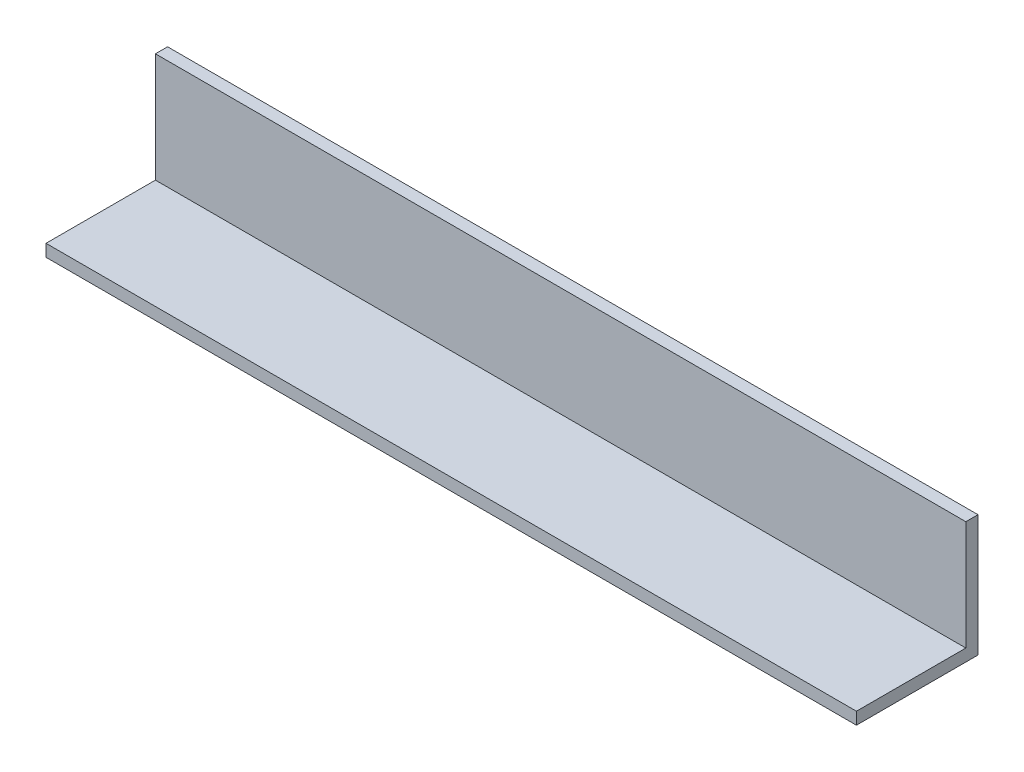
ISO-10303-21;
HEADER;
FILE_DESCRIPTION(('STEP AP214'),'2;1');
FILE_NAME('part.step','',(''),(''),'','','');
FILE_SCHEMA(('AUTOMOTIVE_DESIGN { 1 0 10303 214 1 1 1 1 }'));
ENDSEC;
DATA;
#1=APPLICATION_CONTEXT('core data for automotive mechanical design processes');
#2=APPLICATION_PROTOCOL_DEFINITION('international standard','automotive_design',2000,#1);
#3=PRODUCT_CONTEXT('',#1,'mechanical');
#4=PRODUCT('Part','Part','',(#3));
#5=PRODUCT_RELATED_PRODUCT_CATEGORY('part','',(#4));
#6=PRODUCT_DEFINITION_FORMATION('','',#4);
#7=PRODUCT_DEFINITION_CONTEXT('part definition',#1,'design');
#8=PRODUCT_DEFINITION('design','',#6,#7);
#9=PRODUCT_DEFINITION_SHAPE('','',#8);
#10=(LENGTH_UNIT() NAMED_UNIT(*) SI_UNIT(.MILLI.,.METRE.));
#11=(NAMED_UNIT(*) PLANE_ANGLE_UNIT() SI_UNIT($,.RADIAN.));
#12=(NAMED_UNIT(*) SI_UNIT($,.STERADIAN.) SOLID_ANGLE_UNIT());
#13=UNCERTAINTY_MEASURE_WITH_UNIT(LENGTH_MEASURE(1.E-05),#10,'distance_accuracy_value','');
#14=(GEOMETRIC_REPRESENTATION_CONTEXT(3) GLOBAL_UNCERTAINTY_ASSIGNED_CONTEXT((#13)) GLOBAL_UNIT_ASSIGNED_CONTEXT((#10,
#11,#12)) REPRESENTATION_CONTEXT('',''));
#15=CARTESIAN_POINT('',(0.,0.,0.));
#16=DIRECTION('',(0.,0.,1.));
#17=DIRECTION('',(1.,0.,0.));
#18=AXIS2_PLACEMENT_3D('',#15,#16,#17);
#19=CARTESIAN_POINT('',(100.,0.,0.));
#20=DIRECTION('',(0.,0.,1.));
#21=DIRECTION('',(1.,0.,0.));
#22=AXIS2_PLACEMENT_3D('',#19,#20,#21);
#23=PLANE('',#22);
#24=DIRECTION('',(0.,1.,0.));
#25=VECTOR('',#24,1.);
#26=CARTESIAN_POINT('',(0.,0.,0.));
#27=LINE('',#26,#25);
#28=CARTESIAN_POINT('',(0.,0.,0.));
#29=VERTEX_POINT('',#28);
#30=CARTESIAN_POINT('',(0.,15.,0.));
#31=VERTEX_POINT('',#30);
#32=EDGE_CURVE('E116',#29,#31,#27,.T.);
#33=ORIENTED_EDGE('',*,*,#32,.T.);
#34=DIRECTION('',(-1.,0.,0.));
#35=VECTOR('',#34,1.);
#36=CARTESIAN_POINT('',(100.,15.,0.));
#37=LINE('',#36,#35);
#38=CARTESIAN_POINT('',(100.,15.,0.));
#39=VERTEX_POINT('',#38);
#40=EDGE_CURVE('E11',#39,#31,#37,.T.);
#41=ORIENTED_EDGE('',*,*,#40,.F.);
#42=DIRECTION('',(0.,1.,0.));
#43=VECTOR('',#42,1.);
#44=CARTESIAN_POINT('',(100.,0.,0.));
#45=LINE('',#44,#43);
#46=CARTESIAN_POINT('',(100.,0.,0.));
#47=VERTEX_POINT('',#46);
#48=EDGE_CURVE('E126',#47,#39,#45,.T.);
#49=ORIENTED_EDGE('',*,*,#48,.F.);
#50=DIRECTION('',(-1.,0.,0.));
#51=VECTOR('',#50,1.);
#52=CARTESIAN_POINT('',(100.,0.,0.));
#53=LINE('',#52,#51);
#54=EDGE_CURVE('E112',#47,#29,#53,.T.);
#55=ORIENTED_EDGE('',*,*,#54,.T.);
#56=EDGE_LOOP('',(#33,#41,#49,#55));
#57=FACE_BOUND('',#56,.T.);
#58=ADVANCED_FACE('F32',(#57),#23,.F.);
#59=CARTESIAN_POINT('',(100.,15.,0.));
#60=DIRECTION('',(0.,-1.,0.));
#61=DIRECTION('',(0.,0.,-1.));
#62=AXIS2_PLACEMENT_3D('',#59,#60,#61);
#63=PLANE('',#62);
#64=DIRECTION('',(0.,0.,1.));
#65=VECTOR('',#64,1.);
#66=CARTESIAN_POINT('',(0.,15.,0.));
#67=LINE('',#66,#65);
#68=CARTESIAN_POINT('',(0.,15.,1.5));
#69=VERTEX_POINT('',#68);
#70=EDGE_CURVE('E119',#31,#69,#67,.T.);
#71=ORIENTED_EDGE('',*,*,#70,.T.);
#72=DIRECTION('',(-1.,0.,0.));
#73=VECTOR('',#72,1.);
#74=CARTESIAN_POINT('',(100.,15.,1.5));
#75=LINE('',#74,#73);
#76=CARTESIAN_POINT('',(100.,15.,1.5));
#77=VERTEX_POINT('',#76);
#78=EDGE_CURVE('E40',#77,#69,#75,.T.);
#79=ORIENTED_EDGE('',*,*,#78,.F.);
#80=DIRECTION('',(0.,0.,1.));
#81=VECTOR('',#80,1.);
#82=CARTESIAN_POINT('',(100.,15.,0.));
#83=LINE('',#82,#81);
#84=EDGE_CURVE('E85',#39,#77,#83,.T.);
#85=ORIENTED_EDGE('',*,*,#84,.F.);
#86=ORIENTED_EDGE('',*,*,#40,.T.);
#87=EDGE_LOOP('',(#71,#79,#85,#86));
#88=FACE_BOUND('',#87,.T.);
#89=ADVANCED_FACE('F150',(#88),#63,.F.);
#90=CARTESIAN_POINT('',(100.,1.5,1.5));
#91=DIRECTION('',(0.,0.,-1.));
#92=DIRECTION('',(-1.,0.,0.));
#93=AXIS2_PLACEMENT_3D('',#90,#91,#92);
#94=PLANE('',#93);
#95=DIRECTION('',(0.,-1.,0.));
#96=VECTOR('',#95,1.);
#97=CARTESIAN_POINT('',(0.,1.5,1.5));
#98=LINE('',#97,#96);
#99=CARTESIAN_POINT('',(0.,1.5,1.5));
#100=VERTEX_POINT('',#99);
#101=EDGE_CURVE('E121',#69,#100,#98,.T.);
#102=ORIENTED_EDGE('',*,*,#101,.T.);
#103=DIRECTION('',(-1.,0.,0.));
#104=VECTOR('',#103,1.);
#105=CARTESIAN_POINT('',(100.,1.5,1.5));
#106=LINE('',#105,#104);
#107=CARTESIAN_POINT('',(100.,1.5,1.5));
#108=VERTEX_POINT('',#107);
#109=EDGE_CURVE('E107',#108,#100,#106,.T.);
#110=ORIENTED_EDGE('',*,*,#109,.F.);
#111=DIRECTION('',(0.,-1.,0.));
#112=VECTOR('',#111,1.);
#113=CARTESIAN_POINT('',(100.,1.5,1.5));
#114=LINE('',#113,#112);
#115=EDGE_CURVE('E98',#77,#108,#114,.T.);
#116=ORIENTED_EDGE('',*,*,#115,.F.);
#117=ORIENTED_EDGE('',*,*,#78,.T.);
#118=EDGE_LOOP('',(#102,#110,#116,#117));
#119=FACE_BOUND('',#118,.T.);
#120=ADVANCED_FACE('F132',(#119),#94,.F.);
#121=CARTESIAN_POINT('',(100.,1.5,1.5));
#122=DIRECTION('',(0.,-1.,0.));
#123=DIRECTION('',(0.,0.,-1.));
#124=AXIS2_PLACEMENT_3D('',#121,#122,#123);
#125=PLANE('',#124);
#126=DIRECTION('',(0.,0.,1.));
#127=VECTOR('',#126,1.);
#128=CARTESIAN_POINT('',(0.,1.5,1.5));
#129=LINE('',#128,#127);
#130=CARTESIAN_POINT('',(0.,1.5,15.));
#131=VERTEX_POINT('',#130);
#132=EDGE_CURVE('E106',#100,#131,#129,.T.);
#133=ORIENTED_EDGE('',*,*,#132,.T.);
#134=DIRECTION('',(-1.,0.,0.));
#135=VECTOR('',#134,1.);
#136=CARTESIAN_POINT('',(100.,1.5,15.));
#137=LINE('',#136,#135);
#138=CARTESIAN_POINT('',(100.,1.5,15.));
#139=VERTEX_POINT('',#138);
#140=EDGE_CURVE('E103',#139,#131,#137,.T.);
#141=ORIENTED_EDGE('',*,*,#140,.F.);
#142=DIRECTION('',(0.,0.,1.));
#143=VECTOR('',#142,1.);
#144=CARTESIAN_POINT('',(100.,1.5,1.5));
#145=LINE('',#144,#143);
#146=EDGE_CURVE('E92',#108,#139,#145,.T.);
#147=ORIENTED_EDGE('',*,*,#146,.F.);
#148=ORIENTED_EDGE('',*,*,#109,.T.);
#149=EDGE_LOOP('',(#133,#141,#147,#148));
#150=FACE_BOUND('',#149,.T.);
#151=ADVANCED_FACE('F104',(#150),#125,.F.);
#152=CARTESIAN_POINT('',(100.,0.,15.));
#153=DIRECTION('',(0.,0.,-1.));
#154=DIRECTION('',(-1.,0.,0.));
#155=AXIS2_PLACEMENT_3D('',#152,#153,#154);
#156=PLANE('',#155);
#157=DIRECTION('',(0.,-1.,0.));
#158=VECTOR('',#157,1.);
#159=CARTESIAN_POINT('',(0.,0.,15.));
#160=LINE('',#159,#158);
#161=CARTESIAN_POINT('',(0.,0.,15.));
#162=VERTEX_POINT('',#161);
#163=EDGE_CURVE('E71',#131,#162,#160,.T.);
#164=ORIENTED_EDGE('',*,*,#163,.T.);
#165=DIRECTION('',(-1.,0.,0.));
#166=VECTOR('',#165,1.);
#167=CARTESIAN_POINT('',(100.,0.,15.));
#168=LINE('',#167,#166);
#169=CARTESIAN_POINT('',(100.,0.,15.));
#170=VERTEX_POINT('',#169);
#171=EDGE_CURVE('E108',#170,#162,#168,.T.);
#172=ORIENTED_EDGE('',*,*,#171,.F.);
#173=DIRECTION('',(0.,-1.,0.));
#174=VECTOR('',#173,1.);
#175=CARTESIAN_POINT('',(100.,0.,15.));
#176=LINE('',#175,#174);
#177=EDGE_CURVE('E96',#139,#170,#176,.T.);
#178=ORIENTED_EDGE('',*,*,#177,.F.);
#179=ORIENTED_EDGE('',*,*,#140,.T.);
#180=EDGE_LOOP('',(#164,#172,#178,#179));
#181=FACE_BOUND('',#180,.T.);
#182=ADVANCED_FACE('F110',(#181),#156,.F.);
#183=CARTESIAN_POINT('',(100.,0.,0.));
#184=DIRECTION('',(0.,1.,0.));
#185=DIRECTION('',(0.,0.,1.));
#186=AXIS2_PLACEMENT_3D('',#183,#184,#185);
#187=PLANE('',#186);
#188=DIRECTION('',(0.,0.,-1.));
#189=VECTOR('',#188,1.);
#190=CARTESIAN_POINT('',(0.,0.,0.));
#191=LINE('',#190,#189);
#192=EDGE_CURVE('E77',#162,#29,#191,.T.);
#193=ORIENTED_EDGE('',*,*,#192,.T.);
#194=ORIENTED_EDGE('',*,*,#54,.F.);
#195=DIRECTION('',(0.,0.,-1.));
#196=VECTOR('',#195,1.);
#197=CARTESIAN_POINT('',(100.,0.,0.));
#198=LINE('',#197,#196);
#199=EDGE_CURVE('E48',#170,#47,#198,.T.);
#200=ORIENTED_EDGE('',*,*,#199,.F.);
#201=ORIENTED_EDGE('',*,*,#171,.T.);
#202=EDGE_LOOP('',(#193,#194,#200,#201));
#203=FACE_BOUND('',#202,.T.);
#204=ADVANCED_FACE('F139',(#203),#187,.F.);
#205=CARTESIAN_POINT('',(100.,0.,0.));
#206=DIRECTION('',(1.,0.,0.));
#207=DIRECTION('',(0.,0.,-1.));
#208=AXIS2_PLACEMENT_3D('',#205,#206,#207);
#209=PLANE('',#208);
#210=ORIENTED_EDGE('',*,*,#48,.T.);
#211=ORIENTED_EDGE('',*,*,#84,.T.);
#212=ORIENTED_EDGE('',*,*,#115,.T.);
#213=ORIENTED_EDGE('',*,*,#146,.T.);
#214=ORIENTED_EDGE('',*,*,#177,.T.);
#215=ORIENTED_EDGE('',*,*,#199,.T.);
#216=EDGE_LOOP('',(#210,#211,#212,#213,#214,#215));
#217=FACE_BOUND('',#216,.T.);
#218=ADVANCED_FACE('F94',(#217),#209,.T.);
#219=CARTESIAN_POINT('',(0.,0.,0.));
#220=DIRECTION('',(1.,0.,0.));
#221=DIRECTION('',(0.,0.,-1.));
#222=AXIS2_PLACEMENT_3D('',#219,#220,#221);
#223=PLANE('',#222);
#224=ORIENTED_EDGE('',*,*,#32,.F.);
#225=ORIENTED_EDGE('',*,*,#192,.F.);
#226=ORIENTED_EDGE('',*,*,#163,.F.);
#227=ORIENTED_EDGE('',*,*,#132,.F.);
#228=ORIENTED_EDGE('',*,*,#101,.F.);
#229=ORIENTED_EDGE('',*,*,#70,.F.);
#230=EDGE_LOOP('',(#224,#225,#226,#227,#228,#229));
#231=FACE_BOUND('',#230,.T.);
#232=ADVANCED_FACE('F135',(#231),#223,.F.);
#233=CLOSED_SHELL('',(#58,#89,#120,#151,#182,#204,#218,#232));
#234=MANIFOLD_SOLID_BREP('B2',#233);
#235=ADVANCED_BREP_SHAPE_REPRESENTATION('',(#18,#234),#14);
#236=SHAPE_DEFINITION_REPRESENTATION(#9,#235);
ENDSEC;
END-ISO-10303-21;
